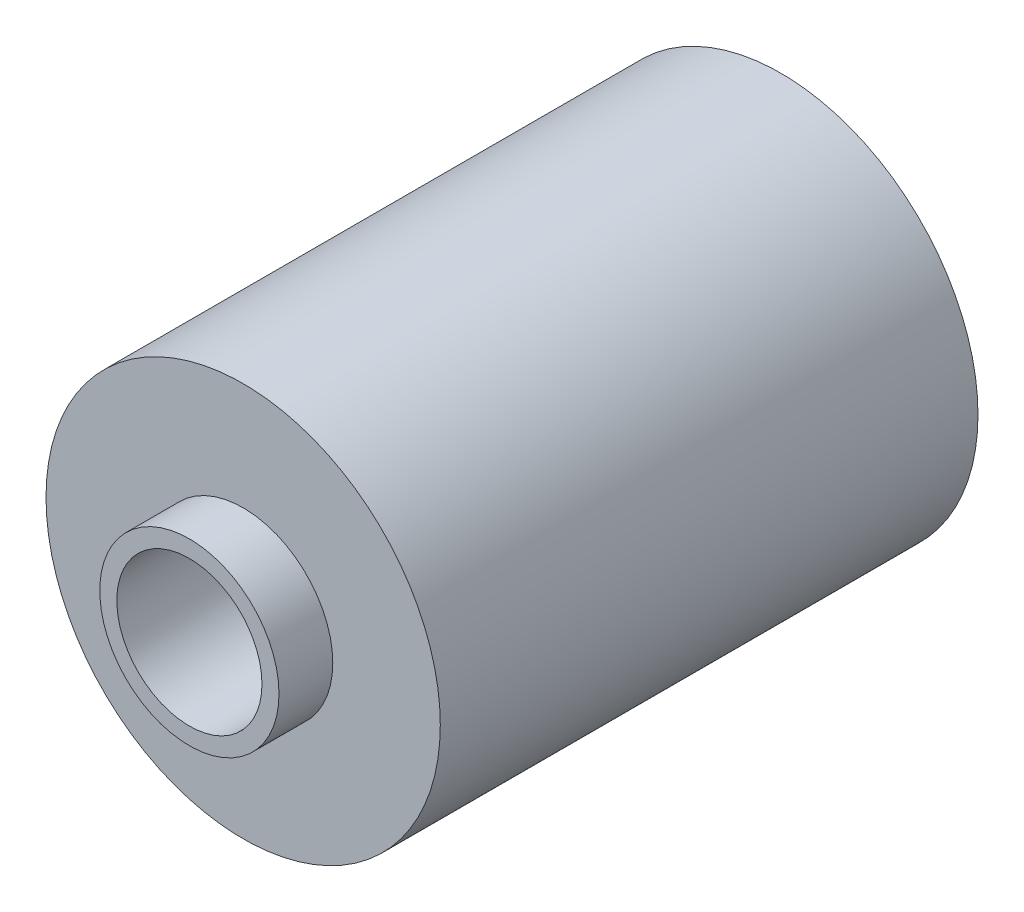
ISO-10303-21;
HEADER;
FILE_DESCRIPTION(('STEP AP214'),'2;1');
FILE_NAME('part.step','',(''),(''),'','','');
FILE_SCHEMA(('AUTOMOTIVE_DESIGN { 1 0 10303 214 1 1 1 1 }'));
ENDSEC;
DATA;
#1=APPLICATION_CONTEXT('core data for automotive mechanical design processes');
#2=APPLICATION_PROTOCOL_DEFINITION('international standard','automotive_design',2000,#1);
#3=PRODUCT_CONTEXT('',#1,'mechanical');
#4=PRODUCT('Part','Part','',(#3));
#5=PRODUCT_RELATED_PRODUCT_CATEGORY('part','',(#4));
#6=PRODUCT_DEFINITION_FORMATION('','',#4);
#7=PRODUCT_DEFINITION_CONTEXT('part definition',#1,'design');
#8=PRODUCT_DEFINITION('design','',#6,#7);
#9=PRODUCT_DEFINITION_SHAPE('','',#8);
#10=(LENGTH_UNIT() NAMED_UNIT(*) SI_UNIT(.MILLI.,.METRE.));
#11=(NAMED_UNIT(*) PLANE_ANGLE_UNIT() SI_UNIT($,.RADIAN.));
#12=(NAMED_UNIT(*) SI_UNIT($,.STERADIAN.) SOLID_ANGLE_UNIT());
#13=UNCERTAINTY_MEASURE_WITH_UNIT(LENGTH_MEASURE(1.E-05),#10,'distance_accuracy_value','');
#14=(GEOMETRIC_REPRESENTATION_CONTEXT(3) GLOBAL_UNCERTAINTY_ASSIGNED_CONTEXT((#13)) GLOBAL_UNIT_ASSIGNED_CONTEXT((#10,
#11,#12)) REPRESENTATION_CONTEXT('',''));
#15=CARTESIAN_POINT('',(0.,0.,0.));
#16=DIRECTION('',(0.,0.,1.));
#17=DIRECTION('',(1.,0.,0.));
#18=AXIS2_PLACEMENT_3D('',#15,#16,#17);
#19=CARTESIAN_POINT('',(0.,0.,15.));
#20=DIRECTION('',(0.,0.,-1.));
#21=DIRECTION('',(-1.,0.,0.));
#22=AXIS2_PLACEMENT_3D('',#19,#20,#21);
#23=CYLINDRICAL_SURFACE('',#22,11.);
#24=CARTESIAN_POINT('',(0.,0.,15.));
#25=DIRECTION('',(0.,0.,1.));
#26=DIRECTION('',(1.,0.,0.));
#27=AXIS2_PLACEMENT_3D('',#24,#25,#26);
#28=CIRCLE('',#27,11.);
#29=CARTESIAN_POINT('',(11.,0.,15.));
#30=VERTEX_POINT('',#29);
#31=EDGE_CURVE('E10',#30,#30,#28,.T.);
#32=ORIENTED_EDGE('',*,*,#31,.F.);
#33=EDGE_LOOP('',(#32));
#34=FACE_BOUND('',#33,.T.);
#35=CARTESIAN_POINT('',(0.,0.,-15.));
#36=DIRECTION('',(0.,0.,1.));
#37=DIRECTION('',(1.,0.,0.));
#38=AXIS2_PLACEMENT_3D('',#35,#36,#37);
#39=CIRCLE('',#38,11.);
#40=CARTESIAN_POINT('',(11.,0.,-15.));
#41=VERTEX_POINT('',#40);
#42=EDGE_CURVE('E38',#41,#41,#39,.T.);
#43=ORIENTED_EDGE('',*,*,#42,.T.);
#44=EDGE_LOOP('',(#43));
#45=FACE_BOUND('',#44,.T.);
#46=ADVANCED_FACE('F31',(#34,#45),#23,.T.);
#47=CARTESIAN_POINT('',(0.,0.,15.));
#48=DIRECTION('',(0.,0.,1.));
#49=DIRECTION('',(1.,0.,0.));
#50=AXIS2_PLACEMENT_3D('',#47,#48,#49);
#51=PLANE('',#50);
#52=CARTESIAN_POINT('',(0.,0.,15.));
#53=DIRECTION('',(0.,0.,1.));
#54=DIRECTION('',(1.,0.,0.));
#55=AXIS2_PLACEMENT_3D('',#52,#53,#54);
#56=CIRCLE('',#55,5.);
#57=CARTESIAN_POINT('',(5.,0.,15.));
#58=VERTEX_POINT('',#57);
#59=EDGE_CURVE('E45',#58,#58,#56,.T.);
#60=ORIENTED_EDGE('',*,*,#59,.F.);
#61=EDGE_LOOP('',(#60));
#62=FACE_BOUND('',#61,.T.);
#63=ORIENTED_EDGE('',*,*,#31,.T.);
#64=EDGE_LOOP('',(#63));
#65=FACE_BOUND('',#64,.T.);
#66=ADVANCED_FACE('F73',(#62,#65),#51,.T.);
#67=CARTESIAN_POINT('',(0.,0.,-15.));
#68=DIRECTION('',(0.,0.,1.));
#69=DIRECTION('',(1.,0.,0.));
#70=AXIS2_PLACEMENT_3D('',#67,#68,#69);
#71=PLANE('',#70);
#72=CARTESIAN_POINT('',(0.,0.,-15.));
#73=DIRECTION('',(0.,0.,1.));
#74=DIRECTION('',(1.,0.,0.));
#75=AXIS2_PLACEMENT_3D('',#72,#73,#74);
#76=CIRCLE('',#75,4.05);
#77=CARTESIAN_POINT('',(4.05,0.,-15.));
#78=VERTEX_POINT('',#77);
#79=EDGE_CURVE('E48',#78,#78,#76,.T.);
#80=ORIENTED_EDGE('',*,*,#79,.T.);
#81=EDGE_LOOP('',(#80));
#82=FACE_BOUND('',#81,.T.);
#83=ORIENTED_EDGE('',*,*,#42,.F.);
#84=EDGE_LOOP('',(#83));
#85=FACE_BOUND('',#84,.T.);
#86=ADVANCED_FACE('F69',(#82,#85),#71,.F.);
#87=CARTESIAN_POINT('',(0.,0.,18.));
#88=DIRECTION('',(0.,0.,-1.));
#89=DIRECTION('',(-1.,0.,0.));
#90=AXIS2_PLACEMENT_3D('',#87,#88,#89);
#91=CYLINDRICAL_SURFACE('',#90,5.);
#92=CARTESIAN_POINT('',(0.,0.,18.));
#93=DIRECTION('',(0.,0.,1.));
#94=DIRECTION('',(1.,0.,0.));
#95=AXIS2_PLACEMENT_3D('',#92,#93,#94);
#96=CIRCLE('',#95,5.);
#97=CARTESIAN_POINT('',(5.,0.,18.));
#98=VERTEX_POINT('',#97);
#99=EDGE_CURVE('E43',#98,#98,#96,.T.);
#100=ORIENTED_EDGE('',*,*,#99,.F.);
#101=EDGE_LOOP('',(#100));
#102=FACE_BOUND('',#101,.T.);
#103=ORIENTED_EDGE('',*,*,#59,.T.);
#104=EDGE_LOOP('',(#103));
#105=FACE_BOUND('',#104,.T.);
#106=ADVANCED_FACE('F63',(#102,#105),#91,.T.);
#107=CARTESIAN_POINT('',(0.,0.,18.));
#108=DIRECTION('',(0.,0.,1.));
#109=DIRECTION('',(1.,0.,0.));
#110=AXIS2_PLACEMENT_3D('',#107,#108,#109);
#111=PLANE('',#110);
#112=CARTESIAN_POINT('',(0.,0.,18.));
#113=DIRECTION('',(0.,0.,1.));
#114=DIRECTION('',(1.,0.,0.));
#115=AXIS2_PLACEMENT_3D('',#112,#113,#114);
#116=CIRCLE('',#115,4.05);
#117=CARTESIAN_POINT('',(4.05,0.,18.));
#118=VERTEX_POINT('',#117);
#119=EDGE_CURVE('E34',#118,#118,#116,.T.);
#120=ORIENTED_EDGE('',*,*,#119,.F.);
#121=EDGE_LOOP('',(#120));
#122=FACE_BOUND('',#121,.T.);
#123=ORIENTED_EDGE('',*,*,#99,.T.);
#124=EDGE_LOOP('',(#123));
#125=FACE_BOUND('',#124,.T.);
#126=ADVANCED_FACE('F60',(#122,#125),#111,.T.);
#127=CARTESIAN_POINT('',(0.,0.,-274.));
#128=DIRECTION('',(0.,0.,1.));
#129=DIRECTION('',(1.,0.,0.));
#130=AXIS2_PLACEMENT_3D('',#127,#128,#129);
#131=CYLINDRICAL_SURFACE('',#130,4.05);
#132=ORIENTED_EDGE('',*,*,#119,.T.);
#133=EDGE_LOOP('',(#132));
#134=FACE_BOUND('',#133,.T.);
#135=ORIENTED_EDGE('',*,*,#79,.F.);
#136=EDGE_LOOP('',(#135));
#137=FACE_BOUND('',#136,.T.);
#138=ADVANCED_FACE('F57',(#134,#137),#131,.F.);
#139=CLOSED_SHELL('',(#46,#66,#86,#106,#126,#138));
#140=MANIFOLD_SOLID_BREP('B2',#139);
#141=ADVANCED_BREP_SHAPE_REPRESENTATION('',(#18,#140),#14);
#142=SHAPE_DEFINITION_REPRESENTATION(#9,#141);
ENDSEC;
END-ISO-10303-21;
